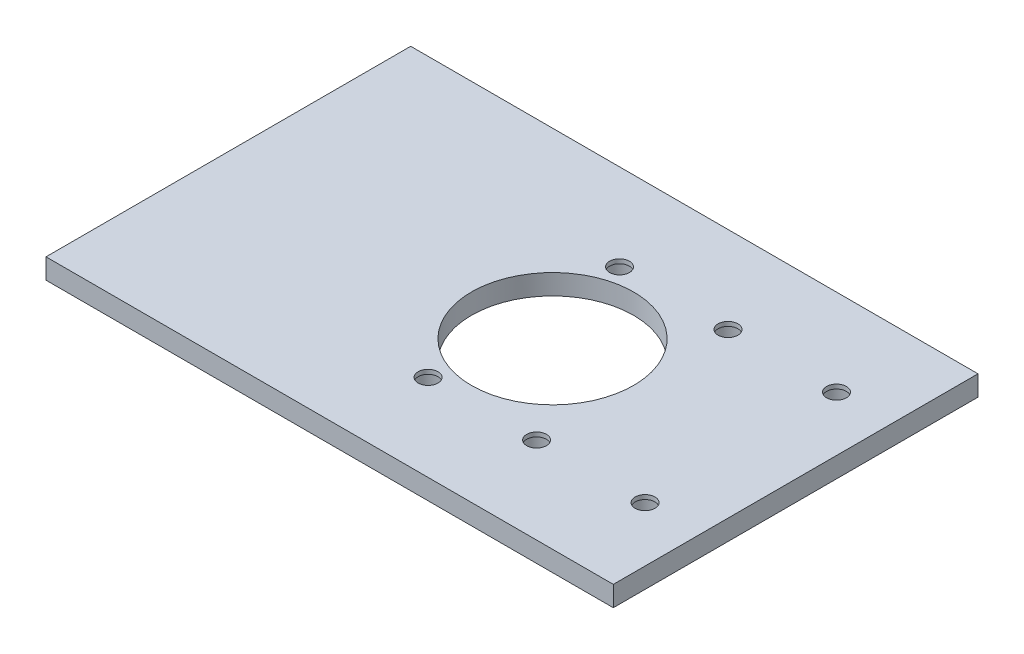
ISO-10303-21;
HEADER;
FILE_DESCRIPTION(('STEP AP214'),'2;1');
FILE_NAME('part.step','',(''),(''),'','','');
FILE_SCHEMA(('AUTOMOTIVE_DESIGN { 1 0 10303 214 1 1 1 1 }'));
ENDSEC;
DATA;
#1=APPLICATION_CONTEXT('core data for automotive mechanical design processes');
#2=APPLICATION_PROTOCOL_DEFINITION('international standard','automotive_design',2000,#1);
#3=PRODUCT_CONTEXT('',#1,'mechanical');
#4=PRODUCT('Part','Part','',(#3));
#5=PRODUCT_RELATED_PRODUCT_CATEGORY('part','',(#4));
#6=PRODUCT_DEFINITION_FORMATION('','',#4);
#7=PRODUCT_DEFINITION_CONTEXT('part definition',#1,'design');
#8=PRODUCT_DEFINITION('design','',#6,#7);
#9=PRODUCT_DEFINITION_SHAPE('','',#8);
#10=(LENGTH_UNIT() NAMED_UNIT(*) SI_UNIT(.MILLI.,.METRE.));
#11=(NAMED_UNIT(*) PLANE_ANGLE_UNIT() SI_UNIT($,.RADIAN.));
#12=(NAMED_UNIT(*) SI_UNIT($,.STERADIAN.) SOLID_ANGLE_UNIT());
#13=UNCERTAINTY_MEASURE_WITH_UNIT(LENGTH_MEASURE(1.E-05),#10,'distance_accuracy_value','');
#14=(GEOMETRIC_REPRESENTATION_CONTEXT(3) GLOBAL_UNCERTAINTY_ASSIGNED_CONTEXT((#13)) GLOBAL_UNIT_ASSIGNED_CONTEXT((#10,
#11,#12)) REPRESENTATION_CONTEXT('',''));
#15=CARTESIAN_POINT('',(0.,0.,0.));
#16=DIRECTION('',(0.,0.,1.));
#17=DIRECTION('',(1.,0.,0.));
#18=AXIS2_PLACEMENT_3D('',#15,#16,#17);
#19=CARTESIAN_POINT('',(-50.8,1.5875,-28.575));
#20=DIRECTION('',(1.,0.,0.));
#21=DIRECTION('',(0.,0.,-1.));
#22=AXIS2_PLACEMENT_3D('',#19,#20,#21);
#23=PLANE('',#22);
#24=DIRECTION('',(0.,0.,1.));
#25=VECTOR('',#24,1.);
#26=CARTESIAN_POINT('',(-50.8,-1.5875,-28.575));
#27=LINE('',#26,#25);
#28=CARTESIAN_POINT('',(-50.8,-1.5875,-28.575));
#29=VERTEX_POINT('',#28);
#30=CARTESIAN_POINT('',(-50.8,-1.5875,28.575));
#31=VERTEX_POINT('',#30);
#32=EDGE_CURVE('E103',#29,#31,#27,.T.);
#33=ORIENTED_EDGE('',*,*,#32,.T.);
#34=DIRECTION('',(0.,-1.,0.));
#35=VECTOR('',#34,1.);
#36=CARTESIAN_POINT('',(-50.8,1.5875,28.575));
#37=LINE('',#36,#35);
#38=CARTESIAN_POINT('',(-50.8,1.5875,28.575));
#39=VERTEX_POINT('',#38);
#40=EDGE_CURVE('E11',#39,#31,#37,.T.);
#41=ORIENTED_EDGE('',*,*,#40,.F.);
#42=DIRECTION('',(0.,0.,1.));
#43=VECTOR('',#42,1.);
#44=CARTESIAN_POINT('',(-50.8,1.5875,-28.575));
#45=LINE('',#44,#43);
#46=CARTESIAN_POINT('',(-50.8,1.5875,-28.575));
#47=VERTEX_POINT('',#46);
#48=EDGE_CURVE('E90',#47,#39,#45,.T.);
#49=ORIENTED_EDGE('',*,*,#48,.F.);
#50=DIRECTION('',(0.,-1.,0.));
#51=VECTOR('',#50,1.);
#52=CARTESIAN_POINT('',(-50.8,1.5875,-28.575));
#53=LINE('',#52,#51);
#54=EDGE_CURVE('E99',#47,#29,#53,.T.);
#55=ORIENTED_EDGE('',*,*,#54,.T.);
#56=EDGE_LOOP('',(#33,#41,#49,#55));
#57=FACE_BOUND('',#56,.T.);
#58=ADVANCED_FACE('F37',(#57),#23,.F.);
#59=CARTESIAN_POINT('',(38.1,1.5875,28.575));
#60=DIRECTION('',(0.,0.,-1.));
#61=DIRECTION('',(-1.,0.,0.));
#62=AXIS2_PLACEMENT_3D('',#59,#60,#61);
#63=PLANE('',#62);
#64=DIRECTION('',(1.,0.,0.));
#65=VECTOR('',#64,1.);
#66=CARTESIAN_POINT('',(38.1,-1.5875,28.575));
#67=LINE('',#66,#65);
#68=CARTESIAN_POINT('',(38.1,-1.5875,28.575));
#69=VERTEX_POINT('',#68);
#70=EDGE_CURVE('E94',#31,#69,#67,.T.);
#71=ORIENTED_EDGE('',*,*,#70,.T.);
#72=DIRECTION('',(0.,-1.,0.));
#73=VECTOR('',#72,1.);
#74=CARTESIAN_POINT('',(38.1,1.5875,28.575));
#75=LINE('',#74,#73);
#76=CARTESIAN_POINT('',(38.1,1.5875,28.575));
#77=VERTEX_POINT('',#76);
#78=EDGE_CURVE('E46',#77,#69,#75,.T.);
#79=ORIENTED_EDGE('',*,*,#78,.F.);
#80=DIRECTION('',(1.,0.,0.));
#81=VECTOR('',#80,1.);
#82=CARTESIAN_POINT('',(38.1,1.5875,28.575));
#83=LINE('',#82,#81);
#84=EDGE_CURVE('E85',#39,#77,#83,.T.);
#85=ORIENTED_EDGE('',*,*,#84,.F.);
#86=ORIENTED_EDGE('',*,*,#40,.T.);
#87=EDGE_LOOP('',(#71,#79,#85,#86));
#88=FACE_BOUND('',#87,.T.);
#89=ADVANCED_FACE('F93',(#88),#63,.F.);
#90=CARTESIAN_POINT('',(38.1,1.5875,-28.575));
#91=DIRECTION('',(-1.,0.,0.));
#92=DIRECTION('',(0.,0.,1.));
#93=AXIS2_PLACEMENT_3D('',#90,#91,#92);
#94=PLANE('',#93);
#95=DIRECTION('',(0.,0.,-1.));
#96=VECTOR('',#95,1.);
#97=CARTESIAN_POINT('',(38.1,-1.5875,-28.575));
#98=LINE('',#97,#96);
#99=CARTESIAN_POINT('',(38.1,-1.5875,-28.575));
#100=VERTEX_POINT('',#99);
#101=EDGE_CURVE('E72',#69,#100,#98,.T.);
#102=ORIENTED_EDGE('',*,*,#101,.T.);
#103=DIRECTION('',(0.,-1.,0.));
#104=VECTOR('',#103,1.);
#105=CARTESIAN_POINT('',(38.1,1.5875,-28.575));
#106=LINE('',#105,#104);
#107=CARTESIAN_POINT('',(38.1,1.5875,-28.575));
#108=VERTEX_POINT('',#107);
#109=EDGE_CURVE('E95',#108,#100,#106,.T.);
#110=ORIENTED_EDGE('',*,*,#109,.F.);
#111=DIRECTION('',(0.,0.,-1.));
#112=VECTOR('',#111,1.);
#113=CARTESIAN_POINT('',(38.1,1.5875,-28.575));
#114=LINE('',#113,#112);
#115=EDGE_CURVE('E88',#77,#108,#114,.T.);
#116=ORIENTED_EDGE('',*,*,#115,.F.);
#117=ORIENTED_EDGE('',*,*,#78,.T.);
#118=EDGE_LOOP('',(#102,#110,#116,#117));
#119=FACE_BOUND('',#118,.T.);
#120=ADVANCED_FACE('F97',(#119),#94,.F.);
#121=CARTESIAN_POINT('',(38.1,1.5875,-28.575));
#122=DIRECTION('',(0.,0.,1.));
#123=DIRECTION('',(1.,0.,0.));
#124=AXIS2_PLACEMENT_3D('',#121,#122,#123);
#125=PLANE('',#124);
#126=DIRECTION('',(-1.,0.,0.));
#127=VECTOR('',#126,1.);
#128=CARTESIAN_POINT('',(38.1,-1.5875,-28.575));
#129=LINE('',#128,#127);
#130=EDGE_CURVE('E78',#100,#29,#129,.T.);
#131=ORIENTED_EDGE('',*,*,#130,.T.);
#132=ORIENTED_EDGE('',*,*,#54,.F.);
#133=DIRECTION('',(-1.,0.,0.));
#134=VECTOR('',#133,1.);
#135=CARTESIAN_POINT('',(38.1,1.5875,-28.575));
#136=LINE('',#135,#134);
#137=EDGE_CURVE('E55',#108,#47,#136,.T.);
#138=ORIENTED_EDGE('',*,*,#137,.F.);
#139=ORIENTED_EDGE('',*,*,#109,.T.);
#140=EDGE_LOOP('',(#131,#132,#138,#139));
#141=FACE_BOUND('',#140,.T.);
#142=ADVANCED_FACE('F216',(#141),#125,.F.);
#143=CARTESIAN_POINT('',(0.,1.5875,0.));
#144=DIRECTION('',(0.,-1.,0.));
#145=DIRECTION('',(0.,0.,-1.));
#146=AXIS2_PLACEMENT_3D('',#143,#144,#145);
#147=PLANE('',#146);
#148=CARTESIAN_POINT('',(29.5,1.5875,-15.));
#149=DIRECTION('',(0.,-1.,0.));
#150=DIRECTION('',(0.,0.,-1.));
#151=AXIS2_PLACEMENT_3D('',#148,#149,#150);
#152=CIRCLE('',#151,1.54999999999997);
#153=CARTESIAN_POINT('',(29.5,1.5875,-16.55));
#154=VERTEX_POINT('',#153);
#155=EDGE_CURVE('E40',#154,#154,#152,.T.);
#156=ORIENTED_EDGE('',*,*,#155,.T.);
#157=EDGE_LOOP('',(#156));
#158=FACE_BOUND('',#157,.T.);
#159=CARTESIAN_POINT('',(12.5,1.5875,-15.));
#160=DIRECTION('',(0.,-1.,0.));
#161=DIRECTION('',(0.,0.,-1.));
#162=AXIS2_PLACEMENT_3D('',#159,#160,#161);
#163=CIRCLE('',#162,1.54999999999997);
#164=CARTESIAN_POINT('',(12.5,1.5875,-16.55));
#165=VERTEX_POINT('',#164);
#166=EDGE_CURVE('E131',#165,#165,#163,.T.);
#167=ORIENTED_EDGE('',*,*,#166,.T.);
#168=EDGE_LOOP('',(#167));
#169=FACE_BOUND('',#168,.T.);
#170=CARTESIAN_POINT('',(-4.5,1.5875,-15.));
#171=DIRECTION('',(0.,-1.,0.));
#172=DIRECTION('',(0.,0.,-1.));
#173=AXIS2_PLACEMENT_3D('',#170,#171,#172);
#174=CIRCLE('',#173,1.54999999999997);
#175=CARTESIAN_POINT('',(-4.5,1.5875,-16.55));
#176=VERTEX_POINT('',#175);
#177=EDGE_CURVE('E127',#176,#176,#174,.T.);
#178=ORIENTED_EDGE('',*,*,#177,.T.);
#179=EDGE_LOOP('',(#178));
#180=FACE_BOUND('',#179,.T.);
#181=CARTESIAN_POINT('',(29.5,1.5875,15.));
#182=DIRECTION('',(0.,-1.,0.));
#183=DIRECTION('',(0.,0.,-1.));
#184=AXIS2_PLACEMENT_3D('',#181,#182,#183);
#185=CIRCLE('',#184,1.54999999999997);
#186=CARTESIAN_POINT('',(29.5,1.5875,13.45));
#187=VERTEX_POINT('',#186);
#188=EDGE_CURVE('E122',#187,#187,#185,.T.);
#189=ORIENTED_EDGE('',*,*,#188,.T.);
#190=EDGE_LOOP('',(#189));
#191=FACE_BOUND('',#190,.T.);
#192=CARTESIAN_POINT('',(12.5,1.5875,15.));
#193=DIRECTION('',(0.,-1.,0.));
#194=DIRECTION('',(0.,0.,-1.));
#195=AXIS2_PLACEMENT_3D('',#192,#193,#194);
#196=CIRCLE('',#195,1.54999999999997);
#197=CARTESIAN_POINT('',(12.5,1.5875,13.45));
#198=VERTEX_POINT('',#197);
#199=EDGE_CURVE('E117',#198,#198,#196,.T.);
#200=ORIENTED_EDGE('',*,*,#199,.T.);
#201=EDGE_LOOP('',(#200));
#202=FACE_BOUND('',#201,.T.);
#203=CARTESIAN_POINT('',(-4.5,1.5875,15.));
#204=DIRECTION('',(0.,-1.,0.));
#205=DIRECTION('',(0.,0.,-1.));
#206=AXIS2_PLACEMENT_3D('',#203,#204,#205);
#207=CIRCLE('',#206,1.54999999999997);
#208=CARTESIAN_POINT('',(-4.5,1.5875,13.45));
#209=VERTEX_POINT('',#208);
#210=EDGE_CURVE('E112',#209,#209,#207,.T.);
#211=ORIENTED_EDGE('',*,*,#210,.T.);
#212=EDGE_LOOP('',(#211));
#213=FACE_BOUND('',#212,.T.);
#214=CARTESIAN_POINT('',(0.,1.5875,0.));
#215=DIRECTION('',(0.,1.,0.));
#216=DIRECTION('',(0.,0.,1.));
#217=AXIS2_PLACEMENT_3D('',#214,#215,#216);
#218=CIRCLE('',#217,12.7);
#219=CARTESIAN_POINT('',(0.,1.5875,12.7));
#220=VERTEX_POINT('',#219);
#221=EDGE_CURVE('E115',#220,#220,#218,.T.);
#222=ORIENTED_EDGE('',*,*,#221,.F.);
#223=EDGE_LOOP('',(#222));
#224=FACE_BOUND('',#223,.T.);
#225=ORIENTED_EDGE('',*,*,#48,.T.);
#226=ORIENTED_EDGE('',*,*,#84,.T.);
#227=ORIENTED_EDGE('',*,*,#115,.T.);
#228=ORIENTED_EDGE('',*,*,#137,.T.);
#229=EDGE_LOOP('',(#225,#226,#227,#228));
#230=FACE_BOUND('',#229,.T.);
#231=ADVANCED_FACE('F86',(#158,#169,#180,#191,#202,#213,#224,#230),#147,.F.);
#232=CARTESIAN_POINT('',(0.,-1.5875,0.));
#233=DIRECTION('',(0.,-1.,0.));
#234=DIRECTION('',(0.,0.,-1.));
#235=AXIS2_PLACEMENT_3D('',#232,#233,#234);
#236=PLANE('',#235);
#237=CARTESIAN_POINT('',(29.5,-1.5875,-15.));
#238=DIRECTION('',(0.,-1.,0.));
#239=DIRECTION('',(0.,0.,-1.));
#240=AXIS2_PLACEMENT_3D('',#237,#238,#239);
#241=CIRCLE('',#240,2.775);
#242=CARTESIAN_POINT('',(29.5,-1.5875,-17.775));
#243=VERTEX_POINT('',#242);
#244=EDGE_CURVE('E563',#243,#243,#241,.T.);
#245=ORIENTED_EDGE('',*,*,#244,.F.);
#246=EDGE_LOOP('',(#245));
#247=FACE_BOUND('',#246,.T.);
#248=CARTESIAN_POINT('',(12.5,-1.5875,-15.));
#249=DIRECTION('',(0.,-1.,0.));
#250=DIRECTION('',(0.,0.,-1.));
#251=AXIS2_PLACEMENT_3D('',#248,#249,#250);
#252=CIRCLE('',#251,2.775);
#253=CARTESIAN_POINT('',(12.5,-1.5875,-17.775));
#254=VERTEX_POINT('',#253);
#255=EDGE_CURVE('E573',#254,#254,#252,.T.);
#256=ORIENTED_EDGE('',*,*,#255,.F.);
#257=EDGE_LOOP('',(#256));
#258=FACE_BOUND('',#257,.T.);
#259=CARTESIAN_POINT('',(-4.5,-1.5875,-15.));
#260=DIRECTION('',(0.,-1.,0.));
#261=DIRECTION('',(0.,0.,-1.));
#262=AXIS2_PLACEMENT_3D('',#259,#260,#261);
#263=CIRCLE('',#262,2.775);
#264=CARTESIAN_POINT('',(-4.5,-1.5875,-17.775));
#265=VERTEX_POINT('',#264);
#266=EDGE_CURVE('E133',#265,#265,#263,.T.);
#267=ORIENTED_EDGE('',*,*,#266,.F.);
#268=EDGE_LOOP('',(#267));
#269=FACE_BOUND('',#268,.T.);
#270=CARTESIAN_POINT('',(29.5,-1.5875,15.));
#271=DIRECTION('',(0.,-1.,0.));
#272=DIRECTION('',(0.,0.,-1.));
#273=AXIS2_PLACEMENT_3D('',#270,#271,#272);
#274=CIRCLE('',#273,2.775);
#275=CARTESIAN_POINT('',(29.5,-1.5875,12.225));
#276=VERTEX_POINT('',#275);
#277=EDGE_CURVE('E129',#276,#276,#274,.T.);
#278=ORIENTED_EDGE('',*,*,#277,.F.);
#279=EDGE_LOOP('',(#278));
#280=FACE_BOUND('',#279,.T.);
#281=CARTESIAN_POINT('',(12.5,-1.5875,15.));
#282=DIRECTION('',(0.,-1.,0.));
#283=DIRECTION('',(0.,0.,-1.));
#284=AXIS2_PLACEMENT_3D('',#281,#282,#283);
#285=CIRCLE('',#284,2.775);
#286=CARTESIAN_POINT('',(12.5,-1.5875,12.225));
#287=VERTEX_POINT('',#286);
#288=EDGE_CURVE('E125',#287,#287,#285,.T.);
#289=ORIENTED_EDGE('',*,*,#288,.F.);
#290=EDGE_LOOP('',(#289));
#291=FACE_BOUND('',#290,.T.);
#292=CARTESIAN_POINT('',(-4.5,-1.5875,15.));
#293=DIRECTION('',(0.,-1.,0.));
#294=DIRECTION('',(0.,0.,-1.));
#295=AXIS2_PLACEMENT_3D('',#292,#293,#294);
#296=CIRCLE('',#295,2.775);
#297=CARTESIAN_POINT('',(-4.5,-1.5875,12.225));
#298=VERTEX_POINT('',#297);
#299=EDGE_CURVE('E120',#298,#298,#296,.T.);
#300=ORIENTED_EDGE('',*,*,#299,.F.);
#301=EDGE_LOOP('',(#300));
#302=FACE_BOUND('',#301,.T.);
#303=CARTESIAN_POINT('',(0.,-1.5875,0.));
#304=DIRECTION('',(0.,-1.,0.));
#305=DIRECTION('',(0.,0.,-1.));
#306=AXIS2_PLACEMENT_3D('',#303,#304,#305);
#307=CIRCLE('',#306,12.7);
#308=CARTESIAN_POINT('',(0.,-1.5875,-12.7));
#309=VERTEX_POINT('',#308);
#310=EDGE_CURVE('E106',#309,#309,#307,.F.);
#311=ORIENTED_EDGE('',*,*,#310,.T.);
#312=EDGE_LOOP('',(#311));
#313=FACE_BOUND('',#312,.T.);
#314=ORIENTED_EDGE('',*,*,#32,.F.);
#315=ORIENTED_EDGE('',*,*,#130,.F.);
#316=ORIENTED_EDGE('',*,*,#101,.F.);
#317=ORIENTED_EDGE('',*,*,#70,.F.);
#318=EDGE_LOOP('',(#314,#315,#316,#317));
#319=FACE_BOUND('',#318,.T.);
#320=ADVANCED_FACE('F192',(#247,#258,#269,#280,#291,#302,#313,#319),#236,.T.);
#321=CARTESIAN_POINT('',(0.,-37.5085244842766,0.));
#322=DIRECTION('',(0.,1.,0.));
#323=DIRECTION('',(0.,0.,1.));
#324=AXIS2_PLACEMENT_3D('',#321,#322,#323);
#325=CYLINDRICAL_SURFACE('',#324,12.7);
#326=ORIENTED_EDGE('',*,*,#221,.T.);
#327=EDGE_LOOP('',(#326));
#328=FACE_BOUND('',#327,.T.);
#329=ORIENTED_EDGE('',*,*,#310,.F.);
#330=EDGE_LOOP('',(#329));
#331=FACE_BOUND('',#330,.T.);
#332=ADVANCED_FACE('F195',(#328,#331),#325,.F.);
#333=CARTESIAN_POINT('',(-4.5,-1.5875,15.));
#334=DIRECTION('',(0.,-1.,0.));
#335=DIRECTION('',(0.,0.,-1.));
#336=AXIS2_PLACEMENT_3D('',#333,#334,#335);
#337=CYLINDRICAL_SURFACE('',#336,1.54999999999997);
#338=CARTESIAN_POINT('',(-4.5,0.912500000000002,15.));
#339=DIRECTION('',(0.,-1.,0.));
#340=DIRECTION('',(0.,0.,-1.));
#341=AXIS2_PLACEMENT_3D('',#338,#339,#340);
#342=CIRCLE('',#341,1.54999999999998);
#343=CARTESIAN_POINT('',(-4.5,0.912500000000002,13.45));
#344=VERTEX_POINT('',#343);
#345=EDGE_CURVE('E116',#344,#344,#342,.T.);
#346=ORIENTED_EDGE('',*,*,#345,.T.);
#347=EDGE_LOOP('',(#346));
#348=FACE_BOUND('',#347,.T.);
#349=ORIENTED_EDGE('',*,*,#210,.F.);
#350=EDGE_LOOP('',(#349));
#351=FACE_BOUND('',#350,.T.);
#352=ADVANCED_FACE('F197',(#348,#351),#337,.F.);
#353=CARTESIAN_POINT('',(-2.95000000000002,0.912499999999999,15.));
#354=DIRECTION('',(0.,1.,0.));
#355=DIRECTION('',(0.,0.,1.));
#356=AXIS2_PLACEMENT_3D('',#353,#354,#355);
#357=PLANE('',#356);
#358=ORIENTED_EDGE('',*,*,#345,.F.);
#359=EDGE_LOOP('',(#358));
#360=FACE_BOUND('',#359,.T.);
#361=CARTESIAN_POINT('',(-4.5,0.912499999999995,15.));
#362=DIRECTION('',(0.,-1.,0.));
#363=DIRECTION('',(0.,0.,-1.));
#364=AXIS2_PLACEMENT_3D('',#361,#362,#363);
#365=CIRCLE('',#364,2.75);
#366=CARTESIAN_POINT('',(-4.5,0.912499999999995,12.25));
#367=VERTEX_POINT('',#366);
#368=EDGE_CURVE('E182',#367,#367,#365,.T.);
#369=ORIENTED_EDGE('',*,*,#368,.T.);
#370=EDGE_LOOP('',(#369));
#371=FACE_BOUND('',#370,.T.);
#372=ADVANCED_FACE('F204',(#360,#371),#357,.F.);
#373=CARTESIAN_POINT('',(-4.5,-1.5875,15.));
#374=DIRECTION('',(0.,-1.,0.));
#375=DIRECTION('',(0.,0.,-1.));
#376=AXIS2_PLACEMENT_3D('',#373,#374,#375);
#377=CYLINDRICAL_SURFACE('',#376,2.75);
#378=ORIENTED_EDGE('',*,*,#368,.F.);
#379=EDGE_LOOP('',(#378));
#380=FACE_BOUND('',#379,.T.);
#381=CARTESIAN_POINT('',(-4.5,-1.5625,15.));
#382=DIRECTION('',(0.,-1.,0.));
#383=DIRECTION('',(0.,0.,-1.));
#384=AXIS2_PLACEMENT_3D('',#381,#382,#383);
#385=CIRCLE('',#384,2.75);
#386=CARTESIAN_POINT('',(-4.5,-1.5625,12.25));
#387=VERTEX_POINT('',#386);
#388=EDGE_CURVE('E179',#387,#387,#385,.T.);
#389=ORIENTED_EDGE('',*,*,#388,.T.);
#390=EDGE_LOOP('',(#389));
#391=FACE_BOUND('',#390,.T.);
#392=ADVANCED_FACE('F280',(#380,#391),#377,.F.);
#393=CARTESIAN_POINT('',(-4.5,-1.5875,15.));
#394=DIRECTION('',(0.,-1.,0.));
#395=DIRECTION('',(0.,0.,-1.));
#396=AXIS2_PLACEMENT_3D('',#393,#394,#395);
#397=CONICAL_SURFACE('',#396,2.775,0.78539816339737);
#398=ORIENTED_EDGE('',*,*,#388,.F.);
#399=EDGE_LOOP('',(#398));
#400=FACE_BOUND('',#399,.T.);
#401=ORIENTED_EDGE('',*,*,#299,.T.);
#402=EDGE_LOOP('',(#401));
#403=FACE_BOUND('',#402,.T.);
#404=ADVANCED_FACE('F290',(#400,#403),#397,.F.);
#405=CARTESIAN_POINT('',(12.5,-1.5875,15.));
#406=DIRECTION('',(0.,-1.,0.));
#407=DIRECTION('',(0.,0.,-1.));
#408=AXIS2_PLACEMENT_3D('',#405,#406,#407);
#409=CYLINDRICAL_SURFACE('',#408,1.54999999999997);
#410=CARTESIAN_POINT('',(12.5,0.912500000000002,15.));
#411=DIRECTION('',(0.,-1.,0.));
#412=DIRECTION('',(0.,0.,-1.));
#413=AXIS2_PLACEMENT_3D('',#410,#411,#412);
#414=CIRCLE('',#413,1.54999999999998);
#415=CARTESIAN_POINT('',(12.5,0.912500000000002,13.45));
#416=VERTEX_POINT('',#415);
#417=EDGE_CURVE('E121',#416,#416,#414,.T.);
#418=ORIENTED_EDGE('',*,*,#417,.T.);
#419=EDGE_LOOP('',(#418));
#420=FACE_BOUND('',#419,.T.);
#421=ORIENTED_EDGE('',*,*,#199,.F.);
#422=EDGE_LOOP('',(#421));
#423=FACE_BOUND('',#422,.T.);
#424=ADVANCED_FACE('F300',(#420,#423),#409,.F.);
#425=CARTESIAN_POINT('',(14.05,0.912499999999999,15.));
#426=DIRECTION('',(0.,1.,0.));
#427=DIRECTION('',(0.,0.,1.));
#428=AXIS2_PLACEMENT_3D('',#425,#426,#427);
#429=PLANE('',#428);
#430=ORIENTED_EDGE('',*,*,#417,.F.);
#431=EDGE_LOOP('',(#430));
#432=FACE_BOUND('',#431,.T.);
#433=CARTESIAN_POINT('',(12.5,0.912499999999995,15.));
#434=DIRECTION('',(0.,-1.,0.));
#435=DIRECTION('',(0.,0.,-1.));
#436=AXIS2_PLACEMENT_3D('',#433,#434,#435);
#437=CIRCLE('',#436,2.75);
#438=CARTESIAN_POINT('',(12.5,0.912499999999995,12.25));
#439=VERTEX_POINT('',#438);
#440=EDGE_CURVE('E172',#439,#439,#437,.T.);
#441=ORIENTED_EDGE('',*,*,#440,.T.);
#442=EDGE_LOOP('',(#441));
#443=FACE_BOUND('',#442,.T.);
#444=ADVANCED_FACE('F310',(#432,#443),#429,.F.);
#445=CARTESIAN_POINT('',(12.5,-1.5875,15.));
#446=DIRECTION('',(0.,-1.,0.));
#447=DIRECTION('',(0.,0.,-1.));
#448=AXIS2_PLACEMENT_3D('',#445,#446,#447);
#449=CYLINDRICAL_SURFACE('',#448,2.75);
#450=ORIENTED_EDGE('',*,*,#440,.F.);
#451=EDGE_LOOP('',(#450));
#452=FACE_BOUND('',#451,.T.);
#453=CARTESIAN_POINT('',(12.5,-1.5625,15.));
#454=DIRECTION('',(0.,-1.,0.));
#455=DIRECTION('',(0.,0.,-1.));
#456=AXIS2_PLACEMENT_3D('',#453,#454,#455);
#457=CIRCLE('',#456,2.75);
#458=CARTESIAN_POINT('',(12.5,-1.5625,12.25));
#459=VERTEX_POINT('',#458);
#460=EDGE_CURVE('E169',#459,#459,#457,.T.);
#461=ORIENTED_EDGE('',*,*,#460,.T.);
#462=EDGE_LOOP('',(#461));
#463=FACE_BOUND('',#462,.T.);
#464=ADVANCED_FACE('F320',(#452,#463),#449,.F.);
#465=CARTESIAN_POINT('',(12.5,-1.5875,15.));
#466=DIRECTION('',(0.,-1.,0.));
#467=DIRECTION('',(0.,0.,-1.));
#468=AXIS2_PLACEMENT_3D('',#465,#466,#467);
#469=CONICAL_SURFACE('',#468,2.775,0.78539816339737);
#470=ORIENTED_EDGE('',*,*,#460,.F.);
#471=EDGE_LOOP('',(#470));
#472=FACE_BOUND('',#471,.T.);
#473=ORIENTED_EDGE('',*,*,#288,.T.);
#474=EDGE_LOOP('',(#473));
#475=FACE_BOUND('',#474,.T.);
#476=ADVANCED_FACE('F330',(#472,#475),#469,.F.);
#477=CARTESIAN_POINT('',(29.5,-1.5875,15.));
#478=DIRECTION('',(0.,-1.,0.));
#479=DIRECTION('',(0.,0.,-1.));
#480=AXIS2_PLACEMENT_3D('',#477,#478,#479);
#481=CYLINDRICAL_SURFACE('',#480,1.54999999999997);
#482=CARTESIAN_POINT('',(29.5,0.912500000000002,15.));
#483=DIRECTION('',(0.,-1.,0.));
#484=DIRECTION('',(0.,0.,-1.));
#485=AXIS2_PLACEMENT_3D('',#482,#483,#484);
#486=CIRCLE('',#485,1.54999999999998);
#487=CARTESIAN_POINT('',(29.5,0.912500000000002,13.45));
#488=VERTEX_POINT('',#487);
#489=EDGE_CURVE('E126',#488,#488,#486,.T.);
#490=ORIENTED_EDGE('',*,*,#489,.T.);
#491=EDGE_LOOP('',(#490));
#492=FACE_BOUND('',#491,.T.);
#493=ORIENTED_EDGE('',*,*,#188,.F.);
#494=EDGE_LOOP('',(#493));
#495=FACE_BOUND('',#494,.T.);
#496=ADVANCED_FACE('F340',(#492,#495),#481,.F.);
#497=CARTESIAN_POINT('',(31.05,0.912499999999999,15.));
#498=DIRECTION('',(0.,1.,0.));
#499=DIRECTION('',(0.,0.,1.));
#500=AXIS2_PLACEMENT_3D('',#497,#498,#499);
#501=PLANE('',#500);
#502=ORIENTED_EDGE('',*,*,#489,.F.);
#503=EDGE_LOOP('',(#502));
#504=FACE_BOUND('',#503,.T.);
#505=CARTESIAN_POINT('',(29.5,0.912499999999995,15.));
#506=DIRECTION('',(0.,-1.,0.));
#507=DIRECTION('',(0.,0.,-1.));
#508=AXIS2_PLACEMENT_3D('',#505,#506,#507);
#509=CIRCLE('',#508,2.75);
#510=CARTESIAN_POINT('',(29.5,0.912499999999995,12.25));
#511=VERTEX_POINT('',#510);
#512=EDGE_CURVE('E162',#511,#511,#509,.T.);
#513=ORIENTED_EDGE('',*,*,#512,.T.);
#514=EDGE_LOOP('',(#513));
#515=FACE_BOUND('',#514,.T.);
#516=ADVANCED_FACE('F350',(#504,#515),#501,.F.);
#517=CARTESIAN_POINT('',(29.5,-1.5875,15.));
#518=DIRECTION('',(0.,-1.,0.));
#519=DIRECTION('',(0.,0.,-1.));
#520=AXIS2_PLACEMENT_3D('',#517,#518,#519);
#521=CYLINDRICAL_SURFACE('',#520,2.75);
#522=ORIENTED_EDGE('',*,*,#512,.F.);
#523=EDGE_LOOP('',(#522));
#524=FACE_BOUND('',#523,.T.);
#525=CARTESIAN_POINT('',(29.5,-1.5625,15.));
#526=DIRECTION('',(0.,-1.,0.));
#527=DIRECTION('',(0.,0.,-1.));
#528=AXIS2_PLACEMENT_3D('',#525,#526,#527);
#529=CIRCLE('',#528,2.75);
#530=CARTESIAN_POINT('',(29.5,-1.5625,12.25));
#531=VERTEX_POINT('',#530);
#532=EDGE_CURVE('E159',#531,#531,#529,.T.);
#533=ORIENTED_EDGE('',*,*,#532,.T.);
#534=EDGE_LOOP('',(#533));
#535=FACE_BOUND('',#534,.T.);
#536=ADVANCED_FACE('F360',(#524,#535),#521,.F.);
#537=CARTESIAN_POINT('',(29.5,-1.5875,15.));
#538=DIRECTION('',(0.,-1.,0.));
#539=DIRECTION('',(0.,0.,-1.));
#540=AXIS2_PLACEMENT_3D('',#537,#538,#539);
#541=CONICAL_SURFACE('',#540,2.775,0.785398163397301);
#542=ORIENTED_EDGE('',*,*,#532,.F.);
#543=EDGE_LOOP('',(#542));
#544=FACE_BOUND('',#543,.T.);
#545=ORIENTED_EDGE('',*,*,#277,.T.);
#546=EDGE_LOOP('',(#545));
#547=FACE_BOUND('',#546,.T.);
#548=ADVANCED_FACE('F370',(#544,#547),#541,.F.);
#549=CARTESIAN_POINT('',(-4.5,-1.5875,-15.));
#550=DIRECTION('',(0.,-1.,0.));
#551=DIRECTION('',(0.,0.,-1.));
#552=AXIS2_PLACEMENT_3D('',#549,#550,#551);
#553=CYLINDRICAL_SURFACE('',#552,1.54999999999997);
#554=CARTESIAN_POINT('',(-4.5,0.912500000000002,-15.));
#555=DIRECTION('',(0.,-1.,0.));
#556=DIRECTION('',(0.,0.,-1.));
#557=AXIS2_PLACEMENT_3D('',#554,#555,#556);
#558=CIRCLE('',#557,1.54999999999998);
#559=CARTESIAN_POINT('',(-4.5,0.912500000000002,-16.55));
#560=VERTEX_POINT('',#559);
#561=EDGE_CURVE('E130',#560,#560,#558,.T.);
#562=ORIENTED_EDGE('',*,*,#561,.T.);
#563=EDGE_LOOP('',(#562));
#564=FACE_BOUND('',#563,.T.);
#565=ORIENTED_EDGE('',*,*,#177,.F.);
#566=EDGE_LOOP('',(#565));
#567=FACE_BOUND('',#566,.T.);
#568=ADVANCED_FACE('F380',(#564,#567),#553,.F.);
#569=CARTESIAN_POINT('',(-2.95000000000002,0.912499999999999,-15.));
#570=DIRECTION('',(0.,1.,0.));
#571=DIRECTION('',(0.,0.,1.));
#572=AXIS2_PLACEMENT_3D('',#569,#570,#571);
#573=PLANE('',#572);
#574=ORIENTED_EDGE('',*,*,#561,.F.);
#575=EDGE_LOOP('',(#574));
#576=FACE_BOUND('',#575,.T.);
#577=CARTESIAN_POINT('',(-4.5,0.912499999999995,-15.));
#578=DIRECTION('',(0.,-1.,0.));
#579=DIRECTION('',(0.,0.,-1.));
#580=AXIS2_PLACEMENT_3D('',#577,#578,#579);
#581=CIRCLE('',#580,2.75);
#582=CARTESIAN_POINT('',(-4.5,0.912499999999995,-17.75));
#583=VERTEX_POINT('',#582);
#584=EDGE_CURVE('E152',#583,#583,#581,.T.);
#585=ORIENTED_EDGE('',*,*,#584,.T.);
#586=EDGE_LOOP('',(#585));
#587=FACE_BOUND('',#586,.T.);
#588=ADVANCED_FACE('F390',(#576,#587),#573,.F.);
#589=CARTESIAN_POINT('',(-4.5,-1.5875,-15.));
#590=DIRECTION('',(0.,-1.,0.));
#591=DIRECTION('',(0.,0.,-1.));
#592=AXIS2_PLACEMENT_3D('',#589,#590,#591);
#593=CYLINDRICAL_SURFACE('',#592,2.75);
#594=ORIENTED_EDGE('',*,*,#584,.F.);
#595=EDGE_LOOP('',(#594));
#596=FACE_BOUND('',#595,.T.);
#597=CARTESIAN_POINT('',(-4.5,-1.5625,-15.));
#598=DIRECTION('',(0.,-1.,0.));
#599=DIRECTION('',(0.,0.,-1.));
#600=AXIS2_PLACEMENT_3D('',#597,#598,#599);
#601=CIRCLE('',#600,2.75);
#602=CARTESIAN_POINT('',(-4.5,-1.5625,-17.75));
#603=VERTEX_POINT('',#602);
#604=EDGE_CURVE('E138',#603,#603,#601,.T.);
#605=ORIENTED_EDGE('',*,*,#604,.T.);
#606=EDGE_LOOP('',(#605));
#607=FACE_BOUND('',#606,.T.);
#608=ADVANCED_FACE('F400',(#596,#607),#593,.F.);
#609=CARTESIAN_POINT('',(-4.5,-1.5875,-15.));
#610=DIRECTION('',(0.,-1.,0.));
#611=DIRECTION('',(0.,0.,-1.));
#612=AXIS2_PLACEMENT_3D('',#609,#610,#611);
#613=CONICAL_SURFACE('',#612,2.775,0.78539816339737);
#614=ORIENTED_EDGE('',*,*,#604,.F.);
#615=EDGE_LOOP('',(#614));
#616=FACE_BOUND('',#615,.T.);
#617=ORIENTED_EDGE('',*,*,#266,.T.);
#618=EDGE_LOOP('',(#617));
#619=FACE_BOUND('',#618,.T.);
#620=ADVANCED_FACE('F410',(#616,#619),#613,.F.);
#621=CARTESIAN_POINT('',(12.5,-1.5875,-15.));
#622=DIRECTION('',(0.,-1.,0.));
#623=DIRECTION('',(0.,0.,-1.));
#624=AXIS2_PLACEMENT_3D('',#621,#622,#623);
#625=CYLINDRICAL_SURFACE('',#624,1.54999999999997);
#626=CARTESIAN_POINT('',(12.5,0.912500000000002,-15.));
#627=DIRECTION('',(0.,-1.,0.));
#628=DIRECTION('',(0.,0.,-1.));
#629=AXIS2_PLACEMENT_3D('',#626,#627,#628);
#630=CIRCLE('',#629,1.54999999999998);
#631=CARTESIAN_POINT('',(12.5,0.912500000000002,-16.55));
#632=VERTEX_POINT('',#631);
#633=EDGE_CURVE('E134',#632,#632,#630,.T.);
#634=ORIENTED_EDGE('',*,*,#633,.T.);
#635=EDGE_LOOP('',(#634));
#636=FACE_BOUND('',#635,.T.);
#637=ORIENTED_EDGE('',*,*,#166,.F.);
#638=EDGE_LOOP('',(#637));
#639=FACE_BOUND('',#638,.T.);
#640=ADVANCED_FACE('F420',(#636,#639),#625,.F.);
#641=CARTESIAN_POINT('',(14.05,0.912499999999999,-15.));
#642=DIRECTION('',(0.,1.,0.));
#643=DIRECTION('',(0.,0.,1.));
#644=AXIS2_PLACEMENT_3D('',#641,#642,#643);
#645=PLANE('',#644);
#646=ORIENTED_EDGE('',*,*,#633,.F.);
#647=EDGE_LOOP('',(#646));
#648=FACE_BOUND('',#647,.T.);
#649=CARTESIAN_POINT('',(12.5,0.912499999999995,-15.));
#650=DIRECTION('',(0.,-1.,0.));
#651=DIRECTION('',(0.,0.,-1.));
#652=AXIS2_PLACEMENT_3D('',#649,#650,#651);
#653=CIRCLE('',#652,2.75);
#654=CARTESIAN_POINT('',(12.5,0.912499999999995,-17.75));
#655=VERTEX_POINT('',#654);
#656=EDGE_CURVE('E141',#655,#655,#653,.T.);
#657=ORIENTED_EDGE('',*,*,#656,.T.);
#658=EDGE_LOOP('',(#657));
#659=FACE_BOUND('',#658,.T.);
#660=ADVANCED_FACE('F430',(#648,#659),#645,.F.);
#661=CARTESIAN_POINT('',(12.5,-1.5875,-15.));
#662=DIRECTION('',(0.,-1.,0.));
#663=DIRECTION('',(0.,0.,-1.));
#664=AXIS2_PLACEMENT_3D('',#661,#662,#663);
#665=CYLINDRICAL_SURFACE('',#664,2.75);
#666=ORIENTED_EDGE('',*,*,#656,.F.);
#667=EDGE_LOOP('',(#666));
#668=FACE_BOUND('',#667,.T.);
#669=CARTESIAN_POINT('',(12.5,-1.5625,-15.));
#670=DIRECTION('',(0.,-1.,0.));
#671=DIRECTION('',(0.,0.,-1.));
#672=AXIS2_PLACEMENT_3D('',#669,#670,#671);
#673=CIRCLE('',#672,2.75);
#674=CARTESIAN_POINT('',(12.5,-1.5625,-17.75));
#675=VERTEX_POINT('',#674);
#676=EDGE_CURVE('E146',#675,#675,#673,.T.);
#677=ORIENTED_EDGE('',*,*,#676,.T.);
#678=EDGE_LOOP('',(#677));
#679=FACE_BOUND('',#678,.T.);
#680=ADVANCED_FACE('F439',(#668,#679),#665,.F.);
#681=CARTESIAN_POINT('',(12.5,-1.5875,-15.));
#682=DIRECTION('',(0.,-1.,0.));
#683=DIRECTION('',(0.,0.,-1.));
#684=AXIS2_PLACEMENT_3D('',#681,#682,#683);
#685=CONICAL_SURFACE('',#684,2.775,0.78539816339737);
#686=ORIENTED_EDGE('',*,*,#676,.F.);
#687=EDGE_LOOP('',(#686));
#688=FACE_BOUND('',#687,.T.);
#689=ORIENTED_EDGE('',*,*,#255,.T.);
#690=EDGE_LOOP('',(#689));
#691=FACE_BOUND('',#690,.T.);
#692=ADVANCED_FACE('F449',(#688,#691),#685,.F.);
#693=CARTESIAN_POINT('',(29.5,-1.5875,-15.));
#694=DIRECTION('',(0.,-1.,0.));
#695=DIRECTION('',(0.,0.,-1.));
#696=AXIS2_PLACEMENT_3D('',#693,#694,#695);
#697=CYLINDRICAL_SURFACE('',#696,1.54999999999997);
#698=CARTESIAN_POINT('',(29.5,0.912500000000002,-15.));
#699=DIRECTION('',(0.,-1.,0.));
#700=DIRECTION('',(0.,0.,-1.));
#701=AXIS2_PLACEMENT_3D('',#698,#699,#700);
#702=CIRCLE('',#701,1.54999999999998);
#703=CARTESIAN_POINT('',(29.5,0.912500000000002,-16.55));
#704=VERTEX_POINT('',#703);
#705=EDGE_CURVE('E570',#704,#704,#702,.T.);
#706=ORIENTED_EDGE('',*,*,#705,.T.);
#707=EDGE_LOOP('',(#706));
#708=FACE_BOUND('',#707,.T.);
#709=ORIENTED_EDGE('',*,*,#155,.F.);
#710=EDGE_LOOP('',(#709));
#711=FACE_BOUND('',#710,.T.);
#712=ADVANCED_FACE('F459',(#708,#711),#697,.F.);
#713=CARTESIAN_POINT('',(31.05,0.912499999999999,-15.));
#714=DIRECTION('',(0.,1.,0.));
#715=DIRECTION('',(0.,0.,1.));
#716=AXIS2_PLACEMENT_3D('',#713,#714,#715);
#717=PLANE('',#716);
#718=ORIENTED_EDGE('',*,*,#705,.F.);
#719=EDGE_LOOP('',(#718));
#720=FACE_BOUND('',#719,.T.);
#721=CARTESIAN_POINT('',(29.5,0.912499999999995,-15.));
#722=DIRECTION('',(0.,-1.,0.));
#723=DIRECTION('',(0.,0.,-1.));
#724=AXIS2_PLACEMENT_3D('',#721,#722,#723);
#725=CIRCLE('',#724,2.75);
#726=CARTESIAN_POINT('',(29.5,0.912499999999995,-17.75));
#727=VERTEX_POINT('',#726);
#728=EDGE_CURVE('E565',#727,#727,#725,.T.);
#729=ORIENTED_EDGE('',*,*,#728,.T.);
#730=EDGE_LOOP('',(#729));
#731=FACE_BOUND('',#730,.T.);
#732=ADVANCED_FACE('F469',(#720,#731),#717,.F.);
#733=CARTESIAN_POINT('',(29.5,-1.5875,-15.));
#734=DIRECTION('',(0.,-1.,0.));
#735=DIRECTION('',(0.,0.,-1.));
#736=AXIS2_PLACEMENT_3D('',#733,#734,#735);
#737=CYLINDRICAL_SURFACE('',#736,2.75);
#738=ORIENTED_EDGE('',*,*,#728,.F.);
#739=EDGE_LOOP('',(#738));
#740=FACE_BOUND('',#739,.T.);
#741=CARTESIAN_POINT('',(29.5,-1.5625,-15.));
#742=DIRECTION('',(0.,-1.,0.));
#743=DIRECTION('',(0.,0.,-1.));
#744=AXIS2_PLACEMENT_3D('',#741,#742,#743);
#745=CIRCLE('',#744,2.75);
#746=CARTESIAN_POINT('',(29.5,-1.5625,-17.75));
#747=VERTEX_POINT('',#746);
#748=EDGE_CURVE('E560',#747,#747,#745,.T.);
#749=ORIENTED_EDGE('',*,*,#748,.T.);
#750=EDGE_LOOP('',(#749));
#751=FACE_BOUND('',#750,.T.);
#752=ADVANCED_FACE('F479',(#740,#751),#737,.F.);
#753=CARTESIAN_POINT('',(29.5,-1.5875,-15.));
#754=DIRECTION('',(0.,-1.,0.));
#755=DIRECTION('',(0.,0.,-1.));
#756=AXIS2_PLACEMENT_3D('',#753,#754,#755);
#757=CONICAL_SURFACE('',#756,2.775,0.785398163397301);
#758=ORIENTED_EDGE('',*,*,#748,.F.);
#759=EDGE_LOOP('',(#758));
#760=FACE_BOUND('',#759,.T.);
#761=ORIENTED_EDGE('',*,*,#244,.T.);
#762=EDGE_LOOP('',(#761));
#763=FACE_BOUND('',#762,.T.);
#764=ADVANCED_FACE('F489',(#760,#763),#757,.F.);
#765=CLOSED_SHELL('',(#58,#89,#120,#142,#231,#320,#332,#352,#372,#392,#404,#424,#444,#464,#476,
#496,#516,#536,#548,#568,#588,#608,#620,#640,#660,#680,#692,#712,#732,#752,#764));
#766=MANIFOLD_SOLID_BREP('B2',#765);
#767=ADVANCED_BREP_SHAPE_REPRESENTATION('',(#18,#766),#14);
#768=SHAPE_DEFINITION_REPRESENTATION(#9,#767);
ENDSEC;
END-ISO-10303-21;
